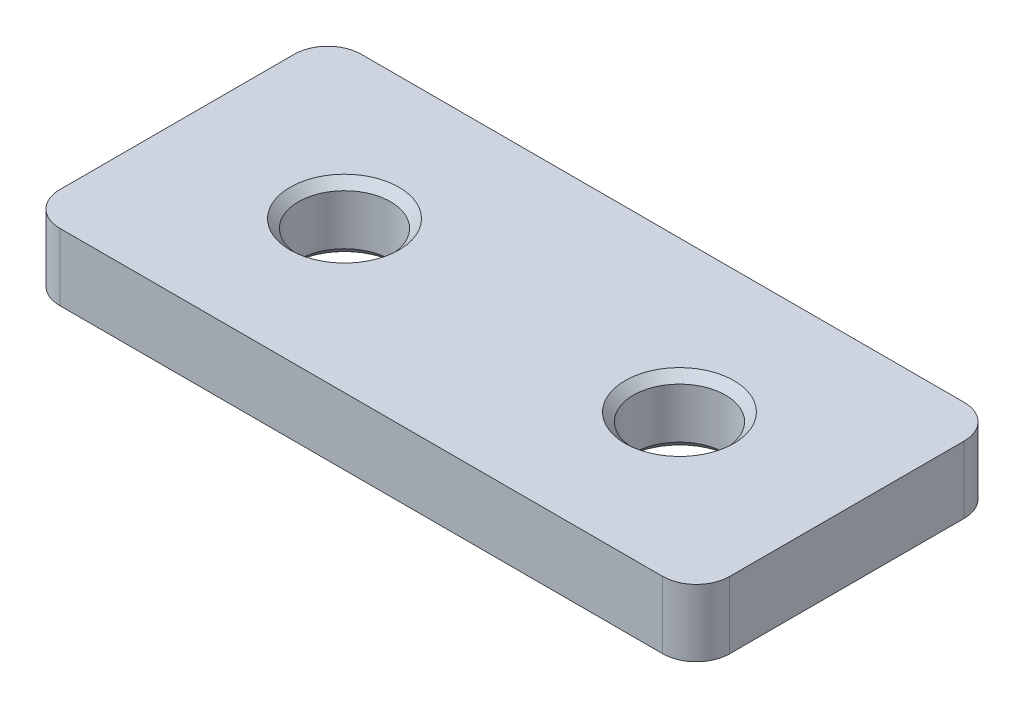
ISO-10303-21;
HEADER;
FILE_DESCRIPTION(('STEP AP214'),'2;1');
FILE_NAME('part.step','',(''),(''),'','','');
FILE_SCHEMA(('AUTOMOTIVE_DESIGN { 1 0 10303 214 1 1 1 1 }'));
ENDSEC;
DATA;
#1=APPLICATION_CONTEXT('core data for automotive mechanical design processes');
#2=APPLICATION_PROTOCOL_DEFINITION('international standard','automotive_design',2000,#1);
#3=PRODUCT_CONTEXT('',#1,'mechanical');
#4=PRODUCT('Part','Part','',(#3));
#5=PRODUCT_RELATED_PRODUCT_CATEGORY('part','',(#4));
#6=PRODUCT_DEFINITION_FORMATION('','',#4);
#7=PRODUCT_DEFINITION_CONTEXT('part definition',#1,'design');
#8=PRODUCT_DEFINITION('design','',#6,#7);
#9=PRODUCT_DEFINITION_SHAPE('','',#8);
#10=(LENGTH_UNIT() NAMED_UNIT(*) SI_UNIT(.MILLI.,.METRE.));
#11=(NAMED_UNIT(*) PLANE_ANGLE_UNIT() SI_UNIT($,.RADIAN.));
#12=(NAMED_UNIT(*) SI_UNIT($,.STERADIAN.) SOLID_ANGLE_UNIT());
#13=UNCERTAINTY_MEASURE_WITH_UNIT(LENGTH_MEASURE(1.E-05),#10,'distance_accuracy_value','');
#14=(GEOMETRIC_REPRESENTATION_CONTEXT(3) GLOBAL_UNCERTAINTY_ASSIGNED_CONTEXT((#13)) GLOBAL_UNIT_ASSIGNED_CONTEXT((#10,
#11,#12)) REPRESENTATION_CONTEXT('',''));
#15=CARTESIAN_POINT('',(0.,0.,0.));
#16=DIRECTION('',(0.,0.,1.));
#17=DIRECTION('',(1.,0.,0.));
#18=AXIS2_PLACEMENT_3D('',#15,#16,#17);
#19=CARTESIAN_POINT('',(0.,2.,0.));
#20=DIRECTION('',(0.,1.,0.));
#21=DIRECTION('',(0.,0.,1.));
#22=AXIS2_PLACEMENT_3D('',#19,#20,#21);
#23=PLANE('',#22);
#24=CARTESIAN_POINT('',(10.,2.,0.));
#25=DIRECTION('',(0.,1.,0.));
#26=DIRECTION('',(0.,0.,1.));
#27=AXIS2_PLACEMENT_3D('',#24,#25,#26);
#28=CIRCLE('',#27,3.25);
#29=CARTESIAN_POINT('',(10.,2.,3.25));
#30=VERTEX_POINT('',#29);
#31=EDGE_CURVE('E10',#30,#30,#28,.F.);
#32=ORIENTED_EDGE('',*,*,#31,.T.);
#33=EDGE_LOOP('',(#32));
#34=FACE_BOUND('',#33,.T.);
#35=CARTESIAN_POINT('',(-10.,2.,0.));
#36=DIRECTION('',(0.,1.,0.));
#37=DIRECTION('',(0.,0.,1.));
#38=AXIS2_PLACEMENT_3D('',#35,#36,#37);
#39=CIRCLE('',#38,3.25);
#40=CARTESIAN_POINT('',(-10.,2.,3.25));
#41=VERTEX_POINT('',#40);
#42=EDGE_CURVE('E24',#41,#41,#39,.F.);
#43=ORIENTED_EDGE('',*,*,#42,.T.);
#44=EDGE_LOOP('',(#43));
#45=FACE_BOUND('',#44,.T.);
#46=DIRECTION('',(-1.,0.,0.));
#47=VECTOR('',#46,1.);
#48=CARTESIAN_POINT('',(20.,2.,-9.));
#49=LINE('',#48,#47);
#50=CARTESIAN_POINT('',(18.,2.,-9.));
#51=VERTEX_POINT('',#50);
#52=CARTESIAN_POINT('',(-18.,2.,-9.));
#53=VERTEX_POINT('',#52);
#54=EDGE_CURVE('E120',#51,#53,#49,.T.);
#55=ORIENTED_EDGE('',*,*,#54,.T.);
#56=CARTESIAN_POINT('',(-18.,2.,-7.));
#57=DIRECTION('',(0.,1.,0.));
#58=DIRECTION('',(0.,0.,1.));
#59=AXIS2_PLACEMENT_3D('',#56,#57,#58);
#60=CIRCLE('',#59,2.);
#61=CARTESIAN_POINT('',(-20.,2.,-7.));
#62=VERTEX_POINT('',#61);
#63=EDGE_CURVE('E150',#53,#62,#60,.T.);
#64=ORIENTED_EDGE('',*,*,#63,.T.);
#65=DIRECTION('',(0.,0.,1.));
#66=VECTOR('',#65,1.);
#67=CARTESIAN_POINT('',(-20.,2.,9.));
#68=LINE('',#67,#66);
#69=CARTESIAN_POINT('',(-20.,2.,7.));
#70=VERTEX_POINT('',#69);
#71=EDGE_CURVE('E104',#62,#70,#68,.T.);
#72=ORIENTED_EDGE('',*,*,#71,.T.);
#73=CARTESIAN_POINT('',(-18.,2.,7.));
#74=DIRECTION('',(0.,1.,0.));
#75=DIRECTION('',(0.,0.,1.));
#76=AXIS2_PLACEMENT_3D('',#73,#74,#75);
#77=CIRCLE('',#76,2.);
#78=CARTESIAN_POINT('',(-18.,2.,9.));
#79=VERTEX_POINT('',#78);
#80=EDGE_CURVE('E147',#70,#79,#77,.T.);
#81=ORIENTED_EDGE('',*,*,#80,.T.);
#82=DIRECTION('',(1.,0.,0.));
#83=VECTOR('',#82,1.);
#84=CARTESIAN_POINT('',(20.,2.,9.));
#85=LINE('',#84,#83);
#86=CARTESIAN_POINT('',(18.,2.,9.));
#87=VERTEX_POINT('',#86);
#88=EDGE_CURVE('E372',#79,#87,#85,.T.);
#89=ORIENTED_EDGE('',*,*,#88,.T.);
#90=CARTESIAN_POINT('',(18.,2.,7.));
#91=DIRECTION('',(0.,1.,0.));
#92=DIRECTION('',(0.,0.,1.));
#93=AXIS2_PLACEMENT_3D('',#90,#91,#92);
#94=CIRCLE('',#93,2.);
#95=CARTESIAN_POINT('',(20.,2.,7.));
#96=VERTEX_POINT('',#95);
#97=EDGE_CURVE('E38',#87,#96,#94,.T.);
#98=ORIENTED_EDGE('',*,*,#97,.T.);
#99=DIRECTION('',(0.,0.,-1.));
#100=VECTOR('',#99,1.);
#101=CARTESIAN_POINT('',(20.,2.,9.));
#102=LINE('',#101,#100);
#103=CARTESIAN_POINT('',(20.,2.,-7.));
#104=VERTEX_POINT('',#103);
#105=EDGE_CURVE('E369',#96,#104,#102,.T.);
#106=ORIENTED_EDGE('',*,*,#105,.T.);
#107=CARTESIAN_POINT('',(18.,2.,-7.));
#108=DIRECTION('',(0.,1.,0.));
#109=DIRECTION('',(0.,0.,1.));
#110=AXIS2_PLACEMENT_3D('',#107,#108,#109);
#111=CIRCLE('',#110,2.);
#112=EDGE_CURVE('E142',#104,#51,#111,.T.);
#113=ORIENTED_EDGE('',*,*,#112,.T.);
#114=EDGE_LOOP('',(#55,#64,#72,#81,#89,#98,#106,#113));
#115=FACE_BOUND('',#114,.T.);
#116=ADVANCED_FACE('F15',(#34,#45,#115),#23,.T.);
#117=CARTESIAN_POINT('',(0.,-2.,0.));
#118=DIRECTION('',(0.,1.,0.));
#119=DIRECTION('',(0.,0.,1.));
#120=AXIS2_PLACEMENT_3D('',#117,#118,#119);
#121=PLANE('',#120);
#122=CARTESIAN_POINT('',(10.,-2.,0.));
#123=DIRECTION('',(0.,1.,0.));
#124=DIRECTION('',(0.,0.,1.));
#125=AXIS2_PLACEMENT_3D('',#122,#123,#124);
#126=CIRCLE('',#125,3.25);
#127=CARTESIAN_POINT('',(10.,-2.,3.25));
#128=VERTEX_POINT('',#127);
#129=EDGE_CURVE('E170',#128,#128,#126,.T.);
#130=ORIENTED_EDGE('',*,*,#129,.T.);
#131=EDGE_LOOP('',(#130));
#132=FACE_BOUND('',#131,.T.);
#133=CARTESIAN_POINT('',(-10.,-2.,0.));
#134=DIRECTION('',(0.,1.,0.));
#135=DIRECTION('',(0.,0.,1.));
#136=AXIS2_PLACEMENT_3D('',#133,#134,#135);
#137=CIRCLE('',#136,3.25);
#138=CARTESIAN_POINT('',(-10.,-2.,3.25));
#139=VERTEX_POINT('',#138);
#140=EDGE_CURVE('E166',#139,#139,#137,.T.);
#141=ORIENTED_EDGE('',*,*,#140,.T.);
#142=EDGE_LOOP('',(#141));
#143=FACE_BOUND('',#142,.T.);
#144=DIRECTION('',(0.,0.,1.));
#145=VECTOR('',#144,1.);
#146=CARTESIAN_POINT('',(-20.,-2.,9.));
#147=LINE('',#146,#145);
#148=CARTESIAN_POINT('',(-20.,-2.,-7.));
#149=VERTEX_POINT('',#148);
#150=CARTESIAN_POINT('',(-20.,-2.,7.));
#151=VERTEX_POINT('',#150);
#152=EDGE_CURVE('E101',#149,#151,#147,.T.);
#153=ORIENTED_EDGE('',*,*,#152,.F.);
#154=CARTESIAN_POINT('',(-18.,-2.,-7.));
#155=DIRECTION('',(0.,1.,0.));
#156=DIRECTION('',(0.,0.,1.));
#157=AXIS2_PLACEMENT_3D('',#154,#155,#156);
#158=CIRCLE('',#157,2.);
#159=CARTESIAN_POINT('',(-18.,-2.,-9.));
#160=VERTEX_POINT('',#159);
#161=EDGE_CURVE('E83',#149,#160,#158,.F.);
#162=ORIENTED_EDGE('',*,*,#161,.T.);
#163=DIRECTION('',(-1.,0.,0.));
#164=VECTOR('',#163,1.);
#165=CARTESIAN_POINT('',(20.,-2.,-9.));
#166=LINE('',#165,#164);
#167=CARTESIAN_POINT('',(18.,-2.,-9.));
#168=VERTEX_POINT('',#167);
#169=EDGE_CURVE('E125',#168,#160,#166,.T.);
#170=ORIENTED_EDGE('',*,*,#169,.F.);
#171=CARTESIAN_POINT('',(18.,-2.,-7.));
#172=DIRECTION('',(0.,1.,0.));
#173=DIRECTION('',(0.,0.,1.));
#174=AXIS2_PLACEMENT_3D('',#171,#172,#173);
#175=CIRCLE('',#174,2.);
#176=CARTESIAN_POINT('',(20.,-2.,-7.));
#177=VERTEX_POINT('',#176);
#178=EDGE_CURVE('E106',#168,#177,#175,.F.);
#179=ORIENTED_EDGE('',*,*,#178,.T.);
#180=DIRECTION('',(0.,0.,-1.));
#181=VECTOR('',#180,1.);
#182=CARTESIAN_POINT('',(20.,-2.,9.));
#183=LINE('',#182,#181);
#184=CARTESIAN_POINT('',(20.,-2.,7.));
#185=VERTEX_POINT('',#184);
#186=EDGE_CURVE('E117',#185,#177,#183,.T.);
#187=ORIENTED_EDGE('',*,*,#186,.F.);
#188=CARTESIAN_POINT('',(18.,-2.,7.));
#189=DIRECTION('',(0.,1.,0.));
#190=DIRECTION('',(0.,0.,1.));
#191=AXIS2_PLACEMENT_3D('',#188,#189,#190);
#192=CIRCLE('',#191,2.);
#193=CARTESIAN_POINT('',(18.,-2.,9.));
#194=VERTEX_POINT('',#193);
#195=EDGE_CURVE('E132',#185,#194,#192,.F.);
#196=ORIENTED_EDGE('',*,*,#195,.T.);
#197=DIRECTION('',(1.,0.,0.));
#198=VECTOR('',#197,1.);
#199=CARTESIAN_POINT('',(20.,-2.,9.));
#200=LINE('',#199,#198);
#201=CARTESIAN_POINT('',(-18.,-2.,9.));
#202=VERTEX_POINT('',#201);
#203=EDGE_CURVE('E112',#202,#194,#200,.T.);
#204=ORIENTED_EDGE('',*,*,#203,.F.);
#205=CARTESIAN_POINT('',(-18.,-2.,7.));
#206=DIRECTION('',(0.,1.,0.));
#207=DIRECTION('',(0.,0.,1.));
#208=AXIS2_PLACEMENT_3D('',#205,#206,#207);
#209=CIRCLE('',#208,2.);
#210=EDGE_CURVE('E95',#202,#151,#209,.F.);
#211=ORIENTED_EDGE('',*,*,#210,.T.);
#212=EDGE_LOOP('',(#153,#162,#170,#179,#187,#196,#204,#211));
#213=FACE_BOUND('',#212,.T.);
#214=ADVANCED_FACE('F109',(#132,#143,#213),#121,.F.);
#215=CARTESIAN_POINT('',(-20.,2.,9.));
#216=DIRECTION('',(1.,0.,0.));
#217=DIRECTION('',(0.,0.,-1.));
#218=AXIS2_PLACEMENT_3D('',#215,#216,#217);
#219=PLANE('',#218);
#220=ORIENTED_EDGE('',*,*,#71,.F.);
#221=DIRECTION('',(0.,-1.,0.));
#222=VECTOR('',#221,1.);
#223=CARTESIAN_POINT('',(-20.,2.,-7.));
#224=LINE('',#223,#222);
#225=EDGE_CURVE('E87',#62,#149,#224,.T.);
#226=ORIENTED_EDGE('',*,*,#225,.T.);
#227=ORIENTED_EDGE('',*,*,#152,.T.);
#228=DIRECTION('',(0.,-1.,0.));
#229=VECTOR('',#228,1.);
#230=CARTESIAN_POINT('',(-20.,2.,7.));
#231=LINE('',#230,#229);
#232=EDGE_CURVE('E107',#151,#70,#231,.F.);
#233=ORIENTED_EDGE('',*,*,#232,.T.);
#234=EDGE_LOOP('',(#220,#226,#227,#233));
#235=FACE_BOUND('',#234,.T.);
#236=ADVANCED_FACE('F100',(#235),#219,.F.);
#237=CARTESIAN_POINT('',(20.,2.,9.));
#238=DIRECTION('',(0.,0.,-1.));
#239=DIRECTION('',(-1.,0.,0.));
#240=AXIS2_PLACEMENT_3D('',#237,#238,#239);
#241=PLANE('',#240);
#242=ORIENTED_EDGE('',*,*,#88,.F.);
#243=DIRECTION('',(0.,-1.,0.));
#244=VECTOR('',#243,1.);
#245=CARTESIAN_POINT('',(-18.,2.,9.));
#246=LINE('',#245,#244);
#247=EDGE_CURVE('E156',#79,#202,#246,.T.);
#248=ORIENTED_EDGE('',*,*,#247,.T.);
#249=ORIENTED_EDGE('',*,*,#203,.T.);
#250=DIRECTION('',(0.,-1.,0.));
#251=VECTOR('',#250,1.);
#252=CARTESIAN_POINT('',(18.,2.,9.));
#253=LINE('',#252,#251);
#254=EDGE_CURVE('E153',#194,#87,#253,.F.);
#255=ORIENTED_EDGE('',*,*,#254,.T.);
#256=EDGE_LOOP('',(#242,#248,#249,#255));
#257=FACE_BOUND('',#256,.T.);
#258=ADVANCED_FACE('F228',(#257),#241,.F.);
#259=CARTESIAN_POINT('',(20.,2.,9.));
#260=DIRECTION('',(-1.,0.,0.));
#261=DIRECTION('',(0.,0.,1.));
#262=AXIS2_PLACEMENT_3D('',#259,#260,#261);
#263=PLANE('',#262);
#264=ORIENTED_EDGE('',*,*,#105,.F.);
#265=DIRECTION('',(0.,-1.,0.));
#266=VECTOR('',#265,1.);
#267=CARTESIAN_POINT('',(20.,2.,7.));
#268=LINE('',#267,#266);
#269=EDGE_CURVE('E162',#96,#185,#268,.T.);
#270=ORIENTED_EDGE('',*,*,#269,.T.);
#271=ORIENTED_EDGE('',*,*,#186,.T.);
#272=DIRECTION('',(0.,-1.,0.));
#273=VECTOR('',#272,1.);
#274=CARTESIAN_POINT('',(20.,2.,-7.));
#275=LINE('',#274,#273);
#276=EDGE_CURVE('E31',#177,#104,#275,.F.);
#277=ORIENTED_EDGE('',*,*,#276,.T.);
#278=EDGE_LOOP('',(#264,#270,#271,#277));
#279=FACE_BOUND('',#278,.T.);
#280=ADVANCED_FACE('F213',(#279),#263,.F.);
#281=CARTESIAN_POINT('',(20.,2.,-9.));
#282=DIRECTION('',(0.,0.,1.));
#283=DIRECTION('',(1.,0.,0.));
#284=AXIS2_PLACEMENT_3D('',#281,#282,#283);
#285=PLANE('',#284);
#286=ORIENTED_EDGE('',*,*,#169,.T.);
#287=DIRECTION('',(0.,-1.,0.));
#288=VECTOR('',#287,1.);
#289=CARTESIAN_POINT('',(-18.,2.,-9.));
#290=LINE('',#289,#288);
#291=EDGE_CURVE('E88',#160,#53,#290,.F.);
#292=ORIENTED_EDGE('',*,*,#291,.T.);
#293=ORIENTED_EDGE('',*,*,#54,.F.);
#294=DIRECTION('',(0.,-1.,0.));
#295=VECTOR('',#294,1.);
#296=CARTESIAN_POINT('',(18.,2.,-9.));
#297=LINE('',#296,#295);
#298=EDGE_CURVE('E94',#51,#168,#297,.T.);
#299=ORIENTED_EDGE('',*,*,#298,.T.);
#300=EDGE_LOOP('',(#286,#292,#293,#299));
#301=FACE_BOUND('',#300,.T.);
#302=ADVANCED_FACE('F202',(#301),#285,.F.);
#303=CARTESIAN_POINT('',(-10.,2.,0.));
#304=DIRECTION('',(0.,-1.,0.));
#305=DIRECTION('',(0.,0.,-1.));
#306=AXIS2_PLACEMENT_3D('',#303,#304,#305);
#307=CYLINDRICAL_SURFACE('',#306,2.75);
#308=CARTESIAN_POINT('',(-10.,-1.5,0.));
#309=DIRECTION('',(0.,1.,0.));
#310=DIRECTION('',(0.,0.,1.));
#311=AXIS2_PLACEMENT_3D('',#308,#309,#310);
#312=CIRCLE('',#311,2.75);
#313=CARTESIAN_POINT('',(-10.,-1.5,2.75));
#314=VERTEX_POINT('',#313);
#315=EDGE_CURVE('E186',#314,#314,#312,.F.);
#316=ORIENTED_EDGE('',*,*,#315,.T.);
#317=EDGE_LOOP('',(#316));
#318=FACE_BOUND('',#317,.T.);
#319=CARTESIAN_POINT('',(-10.,1.5,0.));
#320=DIRECTION('',(0.,1.,0.));
#321=DIRECTION('',(0.,0.,1.));
#322=AXIS2_PLACEMENT_3D('',#319,#320,#321);
#323=CIRCLE('',#322,2.75);
#324=CARTESIAN_POINT('',(-10.,1.5,2.75));
#325=VERTEX_POINT('',#324);
#326=EDGE_CURVE('E182',#325,#325,#323,.T.);
#327=ORIENTED_EDGE('',*,*,#326,.T.);
#328=EDGE_LOOP('',(#327));
#329=FACE_BOUND('',#328,.T.);
#330=ADVANCED_FACE('F199',(#318,#329),#307,.F.);
#331=CARTESIAN_POINT('',(10.,2.,0.));
#332=DIRECTION('',(0.,-1.,0.));
#333=DIRECTION('',(0.,0.,-1.));
#334=AXIS2_PLACEMENT_3D('',#331,#332,#333);
#335=CYLINDRICAL_SURFACE('',#334,2.75);
#336=CARTESIAN_POINT('',(10.,-1.5,0.));
#337=DIRECTION('',(0.,1.,0.));
#338=DIRECTION('',(0.,0.,1.));
#339=AXIS2_PLACEMENT_3D('',#336,#337,#338);
#340=CIRCLE('',#339,2.75);
#341=CARTESIAN_POINT('',(10.,-1.5,2.75));
#342=VERTEX_POINT('',#341);
#343=EDGE_CURVE('E178',#342,#342,#340,.F.);
#344=ORIENTED_EDGE('',*,*,#343,.T.);
#345=EDGE_LOOP('',(#344));
#346=FACE_BOUND('',#345,.T.);
#347=CARTESIAN_POINT('',(10.,1.5,0.));
#348=DIRECTION('',(0.,1.,0.));
#349=DIRECTION('',(0.,0.,1.));
#350=AXIS2_PLACEMENT_3D('',#347,#348,#349);
#351=CIRCLE('',#350,2.75);
#352=CARTESIAN_POINT('',(10.,1.5,2.75));
#353=VERTEX_POINT('',#352);
#354=EDGE_CURVE('E174',#353,#353,#351,.T.);
#355=ORIENTED_EDGE('',*,*,#354,.T.);
#356=EDGE_LOOP('',(#355));
#357=FACE_BOUND('',#356,.T.);
#358=ADVANCED_FACE('F201',(#346,#357),#335,.F.);
#359=CARTESIAN_POINT('',(-18.,2.,-7.));
#360=DIRECTION('',(0.,-1.,0.));
#361=DIRECTION('',(0.,0.,-1.));
#362=AXIS2_PLACEMENT_3D('',#359,#360,#361);
#363=CYLINDRICAL_SURFACE('',#362,2.);
#364=ORIENTED_EDGE('',*,*,#63,.F.);
#365=ORIENTED_EDGE('',*,*,#291,.F.);
#366=ORIENTED_EDGE('',*,*,#161,.F.);
#367=ORIENTED_EDGE('',*,*,#225,.F.);
#368=EDGE_LOOP('',(#364,#365,#366,#367));
#369=FACE_BOUND('',#368,.T.);
#370=ADVANCED_FACE('F86',(#369),#363,.T.);
#371=CARTESIAN_POINT('',(-18.,2.,7.));
#372=DIRECTION('',(0.,-1.,0.));
#373=DIRECTION('',(0.,0.,-1.));
#374=AXIS2_PLACEMENT_3D('',#371,#372,#373);
#375=CYLINDRICAL_SURFACE('',#374,2.);
#376=ORIENTED_EDGE('',*,*,#80,.F.);
#377=ORIENTED_EDGE('',*,*,#232,.F.);
#378=ORIENTED_EDGE('',*,*,#210,.F.);
#379=ORIENTED_EDGE('',*,*,#247,.F.);
#380=EDGE_LOOP('',(#376,#377,#378,#379));
#381=FACE_BOUND('',#380,.T.);
#382=ADVANCED_FACE('F236',(#381),#375,.T.);
#383=CARTESIAN_POINT('',(18.,2.,7.));
#384=DIRECTION('',(0.,-1.,0.));
#385=DIRECTION('',(0.,0.,-1.));
#386=AXIS2_PLACEMENT_3D('',#383,#384,#385);
#387=CYLINDRICAL_SURFACE('',#386,2.);
#388=ORIENTED_EDGE('',*,*,#97,.F.);
#389=ORIENTED_EDGE('',*,*,#254,.F.);
#390=ORIENTED_EDGE('',*,*,#195,.F.);
#391=ORIENTED_EDGE('',*,*,#269,.F.);
#392=EDGE_LOOP('',(#388,#389,#390,#391));
#393=FACE_BOUND('',#392,.T.);
#394=ADVANCED_FACE('F239',(#393),#387,.T.);
#395=CARTESIAN_POINT('',(18.,2.,-7.));
#396=DIRECTION('',(0.,-1.,0.));
#397=DIRECTION('',(0.,0.,-1.));
#398=AXIS2_PLACEMENT_3D('',#395,#396,#397);
#399=CYLINDRICAL_SURFACE('',#398,2.);
#400=ORIENTED_EDGE('',*,*,#112,.F.);
#401=ORIENTED_EDGE('',*,*,#276,.F.);
#402=ORIENTED_EDGE('',*,*,#178,.F.);
#403=ORIENTED_EDGE('',*,*,#298,.F.);
#404=EDGE_LOOP('',(#400,#401,#402,#403));
#405=FACE_BOUND('',#404,.T.);
#406=ADVANCED_FACE('F243',(#405),#399,.T.);
#407=CARTESIAN_POINT('',(10.,-2.,0.));
#408=DIRECTION('',(0.,-1.,0.));
#409=DIRECTION('',(0.,0.,-1.));
#410=AXIS2_PLACEMENT_3D('',#407,#408,#409);
#411=CONICAL_SURFACE('',#410,3.25,0.785398163397449);
#412=ORIENTED_EDGE('',*,*,#343,.F.);
#413=EDGE_LOOP('',(#412));
#414=FACE_BOUND('',#413,.T.);
#415=ORIENTED_EDGE('',*,*,#129,.F.);
#416=EDGE_LOOP('',(#415));
#417=FACE_BOUND('',#416,.T.);
#418=ADVANCED_FACE('F247',(#414,#417),#411,.F.);
#419=CARTESIAN_POINT('',(-10.,-2.,0.));
#420=DIRECTION('',(0.,-1.,0.));
#421=DIRECTION('',(0.,0.,-1.));
#422=AXIS2_PLACEMENT_3D('',#419,#420,#421);
#423=CONICAL_SURFACE('',#422,3.25,0.785398163397449);
#424=ORIENTED_EDGE('',*,*,#315,.F.);
#425=EDGE_LOOP('',(#424));
#426=FACE_BOUND('',#425,.T.);
#427=ORIENTED_EDGE('',*,*,#140,.F.);
#428=EDGE_LOOP('',(#427));
#429=FACE_BOUND('',#428,.T.);
#430=ADVANCED_FACE('F251',(#426,#429),#423,.F.);
#431=CARTESIAN_POINT('',(10.,1.5,0.));
#432=DIRECTION('',(0.,1.,0.));
#433=DIRECTION('',(0.,0.,1.));
#434=AXIS2_PLACEMENT_3D('',#431,#432,#433);
#435=CONICAL_SURFACE('',#434,2.75,0.785398163397444);
#436=ORIENTED_EDGE('',*,*,#31,.F.);
#437=EDGE_LOOP('',(#436));
#438=FACE_BOUND('',#437,.T.);
#439=ORIENTED_EDGE('',*,*,#354,.F.);
#440=EDGE_LOOP('',(#439));
#441=FACE_BOUND('',#440,.T.);
#442=ADVANCED_FACE('F196',(#438,#441),#435,.F.);
#443=CARTESIAN_POINT('',(-10.,1.5,0.));
#444=DIRECTION('',(0.,1.,0.));
#445=DIRECTION('',(0.,0.,1.));
#446=AXIS2_PLACEMENT_3D('',#443,#444,#445);
#447=CONICAL_SURFACE('',#446,2.75,0.785398163397444);
#448=ORIENTED_EDGE('',*,*,#42,.F.);
#449=EDGE_LOOP('',(#448));
#450=FACE_BOUND('',#449,.T.);
#451=ORIENTED_EDGE('',*,*,#326,.F.);
#452=EDGE_LOOP('',(#451));
#453=FACE_BOUND('',#452,.T.);
#454=ADVANCED_FACE('F17',(#450,#453),#447,.F.);
#455=CLOSED_SHELL('',(#116,#214,#236,#258,#280,#302,#330,#358,#370,#382,#394,#406,#418,#430,
#442,#454));
#456=MANIFOLD_SOLID_BREP('B1',#455);
#457=ADVANCED_BREP_SHAPE_REPRESENTATION('',(#18,#456),#14);
#458=SHAPE_DEFINITION_REPRESENTATION(#9,#457);
ENDSEC;
END-ISO-10303-21;
